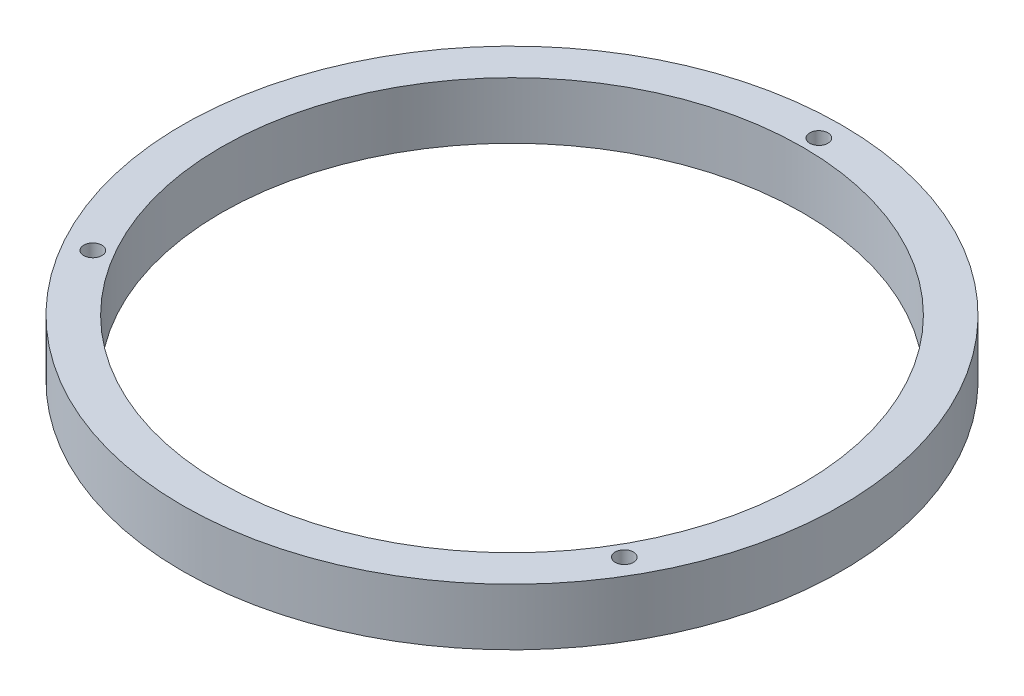
ISO-10303-21;
HEADER;
FILE_DESCRIPTION(('STEP AP214'),'2;1');
FILE_NAME('part.step','',(''),(''),'','','');
FILE_SCHEMA(('AUTOMOTIVE_DESIGN { 1 0 10303 214 1 1 1 1 }'));
ENDSEC;
DATA;
#1=APPLICATION_CONTEXT('core data for automotive mechanical design processes');
#2=APPLICATION_PROTOCOL_DEFINITION('international standard','automotive_design',2000,#1);
#3=PRODUCT_CONTEXT('',#1,'mechanical');
#4=PRODUCT('Part','Part','',(#3));
#5=PRODUCT_RELATED_PRODUCT_CATEGORY('part','',(#4));
#6=PRODUCT_DEFINITION_FORMATION('','',#4);
#7=PRODUCT_DEFINITION_CONTEXT('part definition',#1,'design');
#8=PRODUCT_DEFINITION('design','',#6,#7);
#9=PRODUCT_DEFINITION_SHAPE('','',#8);
#10=(LENGTH_UNIT() NAMED_UNIT(*) SI_UNIT(.MILLI.,.METRE.));
#11=(NAMED_UNIT(*) PLANE_ANGLE_UNIT() SI_UNIT($,.RADIAN.));
#12=(NAMED_UNIT(*) SI_UNIT($,.STERADIAN.) SOLID_ANGLE_UNIT());
#13=UNCERTAINTY_MEASURE_WITH_UNIT(LENGTH_MEASURE(1.E-05),#10,'distance_accuracy_value','');
#14=(GEOMETRIC_REPRESENTATION_CONTEXT(3) GLOBAL_UNCERTAINTY_ASSIGNED_CONTEXT((#13)) GLOBAL_UNIT_ASSIGNED_CONTEXT((#10,
#11,#12)) REPRESENTATION_CONTEXT('',''));
#15=CARTESIAN_POINT('',(0.,0.,0.));
#16=DIRECTION('',(0.,0.,1.));
#17=DIRECTION('',(1.,0.,0.));
#18=AXIS2_PLACEMENT_3D('',#15,#16,#17);
#19=CARTESIAN_POINT('',(0.,12.5,0.));
#20=DIRECTION('',(0.,-1.,0.));
#21=DIRECTION('',(0.,0.,-1.));
#22=AXIS2_PLACEMENT_3D('',#19,#20,#21);
#23=CYLINDRICAL_SURFACE('',#22,64.);
#24=CARTESIAN_POINT('',(0.,12.5,0.));
#25=DIRECTION('',(0.,1.,0.));
#26=DIRECTION('',(0.,0.,1.));
#27=AXIS2_PLACEMENT_3D('',#24,#25,#26);
#28=CIRCLE('',#27,64.);
#29=CARTESIAN_POINT('',(0.,12.5,64.));
#30=VERTEX_POINT('',#29);
#31=EDGE_CURVE('E54',#30,#30,#28,.T.);
#32=ORIENTED_EDGE('',*,*,#31,.T.);
#33=EDGE_LOOP('',(#32));
#34=FACE_BOUND('',#33,.T.);
#35=CARTESIAN_POINT('',(0.,0.,0.));
#36=DIRECTION('',(0.,1.,0.));
#37=DIRECTION('',(0.,0.,1.));
#38=AXIS2_PLACEMENT_3D('',#35,#36,#37);
#39=CIRCLE('',#38,64.);
#40=CARTESIAN_POINT('',(0.,0.,64.));
#41=VERTEX_POINT('',#40);
#42=EDGE_CURVE('E75',#41,#41,#39,.T.);
#43=ORIENTED_EDGE('',*,*,#42,.F.);
#44=EDGE_LOOP('',(#43));
#45=FACE_BOUND('',#44,.T.);
#46=ADVANCED_FACE('F45',(#34,#45),#23,.F.);
#47=CARTESIAN_POINT('',(0.,12.5,-67.5));
#48=DIRECTION('',(0.,-1.,0.));
#49=DIRECTION('',(0.,0.,-1.));
#50=AXIS2_PLACEMENT_3D('',#47,#48,#49);
#51=CYLINDRICAL_SURFACE('',#50,2.);
#52=CARTESIAN_POINT('',(0.,12.5,-67.5));
#53=DIRECTION('',(0.,1.,0.));
#54=DIRECTION('',(0.,0.,1.));
#55=AXIS2_PLACEMENT_3D('',#52,#53,#54);
#56=CIRCLE('',#55,2.);
#57=CARTESIAN_POINT('',(0.,12.5,-65.5));
#58=VERTEX_POINT('',#57);
#59=EDGE_CURVE('E60',#58,#58,#56,.T.);
#60=ORIENTED_EDGE('',*,*,#59,.T.);
#61=EDGE_LOOP('',(#60));
#62=FACE_BOUND('',#61,.T.);
#63=CARTESIAN_POINT('',(0.,0.,-67.5));
#64=DIRECTION('',(0.,1.,0.));
#65=DIRECTION('',(0.,0.,1.));
#66=AXIS2_PLACEMENT_3D('',#63,#64,#65);
#67=CIRCLE('',#66,2.);
#68=CARTESIAN_POINT('',(0.,0.,-65.5));
#69=VERTEX_POINT('',#68);
#70=EDGE_CURVE('E72',#69,#69,#67,.T.);
#71=ORIENTED_EDGE('',*,*,#70,.F.);
#72=EDGE_LOOP('',(#71));
#73=FACE_BOUND('',#72,.T.);
#74=ADVANCED_FACE('F98',(#62,#73),#51,.F.);
#75=CARTESIAN_POINT('',(58.4567147554536,12.5,33.7499999999977));
#76=DIRECTION('',(0.,-1.,0.));
#77=DIRECTION('',(0.,0.,-1.));
#78=AXIS2_PLACEMENT_3D('',#75,#76,#77);
#79=CYLINDRICAL_SURFACE('',#78,2.);
#80=CARTESIAN_POINT('',(58.4567147554536,12.5,33.7499999999977));
#81=DIRECTION('',(0.,1.,0.));
#82=DIRECTION('',(0.,0.,1.));
#83=AXIS2_PLACEMENT_3D('',#80,#81,#82);
#84=CIRCLE('',#83,2.);
#85=CARTESIAN_POINT('',(58.4567147554536,12.5,35.7499999999977));
#86=VERTEX_POINT('',#85);
#87=EDGE_CURVE('E87',#86,#86,#84,.T.);
#88=ORIENTED_EDGE('',*,*,#87,.T.);
#89=EDGE_LOOP('',(#88));
#90=FACE_BOUND('',#89,.T.);
#91=CARTESIAN_POINT('',(58.4567147554536,0.,33.7499999999977));
#92=DIRECTION('',(0.,1.,0.));
#93=DIRECTION('',(0.,0.,1.));
#94=AXIS2_PLACEMENT_3D('',#91,#92,#93);
#95=CIRCLE('',#94,2.);
#96=CARTESIAN_POINT('',(58.4567147554536,0.,35.7499999999977));
#97=VERTEX_POINT('',#96);
#98=EDGE_CURVE('E68',#97,#97,#95,.T.);
#99=ORIENTED_EDGE('',*,*,#98,.F.);
#100=EDGE_LOOP('',(#99));
#101=FACE_BOUND('',#100,.T.);
#102=ADVANCED_FACE('F116',(#90,#101),#79,.F.);
#103=CARTESIAN_POINT('',(-58.4567147554457,12.5,33.7500000000023));
#104=DIRECTION('',(0.,-1.,0.));
#105=DIRECTION('',(0.,0.,-1.));
#106=AXIS2_PLACEMENT_3D('',#103,#104,#105);
#107=CYLINDRICAL_SURFACE('',#106,2.);
#108=CARTESIAN_POINT('',(-58.4567147554457,12.5,33.7500000000023));
#109=DIRECTION('',(0.,1.,0.));
#110=DIRECTION('',(0.,0.,1.));
#111=AXIS2_PLACEMENT_3D('',#108,#109,#110);
#112=CIRCLE('',#111,2.);
#113=CARTESIAN_POINT('',(-58.4567147554457,12.5,35.7500000000023));
#114=VERTEX_POINT('',#113);
#115=EDGE_CURVE('E82',#114,#114,#112,.T.);
#116=ORIENTED_EDGE('',*,*,#115,.T.);
#117=EDGE_LOOP('',(#116));
#118=FACE_BOUND('',#117,.T.);
#119=CARTESIAN_POINT('',(-58.4567147554457,0.,33.7500000000023));
#120=DIRECTION('',(0.,1.,0.));
#121=DIRECTION('',(0.,0.,1.));
#122=AXIS2_PLACEMENT_3D('',#119,#120,#121);
#123=CIRCLE('',#122,2.);
#124=CARTESIAN_POINT('',(-58.4567147554457,0.,35.7500000000023));
#125=VERTEX_POINT('',#124);
#126=EDGE_CURVE('E64',#125,#125,#123,.T.);
#127=ORIENTED_EDGE('',*,*,#126,.F.);
#128=EDGE_LOOP('',(#127));
#129=FACE_BOUND('',#128,.T.);
#130=ADVANCED_FACE('F47',(#118,#129),#107,.F.);
#131=CARTESIAN_POINT('',(0.,12.5,0.));
#132=DIRECTION('',(0.,-1.,0.));
#133=DIRECTION('',(0.,0.,-1.));
#134=AXIS2_PLACEMENT_3D('',#131,#132,#133);
#135=CYLINDRICAL_SURFACE('',#134,72.5);
#136=CARTESIAN_POINT('',(0.,12.5,0.));
#137=DIRECTION('',(0.,1.,0.));
#138=DIRECTION('',(0.,0.,1.));
#139=AXIS2_PLACEMENT_3D('',#136,#137,#138);
#140=CIRCLE('',#139,72.5);
#141=CARTESIAN_POINT('',(0.,12.5,72.5));
#142=VERTEX_POINT('',#141);
#143=EDGE_CURVE('E10',#142,#142,#140,.T.);
#144=ORIENTED_EDGE('',*,*,#143,.F.);
#145=EDGE_LOOP('',(#144));
#146=FACE_BOUND('',#145,.T.);
#147=CARTESIAN_POINT('',(0.,0.,0.));
#148=DIRECTION('',(0.,1.,0.));
#149=DIRECTION('',(0.,0.,1.));
#150=AXIS2_PLACEMENT_3D('',#147,#148,#149);
#151=CIRCLE('',#150,72.5);
#152=CARTESIAN_POINT('',(0.,0.,72.5));
#153=VERTEX_POINT('',#152);
#154=EDGE_CURVE('E49',#153,#153,#151,.T.);
#155=ORIENTED_EDGE('',*,*,#154,.T.);
#156=EDGE_LOOP('',(#155));
#157=FACE_BOUND('',#156,.T.);
#158=ADVANCED_FACE('F105',(#146,#157),#135,.T.);
#159=CARTESIAN_POINT('',(0.,12.5,0.));
#160=DIRECTION('',(0.,1.,0.));
#161=DIRECTION('',(0.,0.,1.));
#162=AXIS2_PLACEMENT_3D('',#159,#160,#161);
#163=PLANE('',#162);
#164=ORIENTED_EDGE('',*,*,#115,.F.);
#165=EDGE_LOOP('',(#164));
#166=FACE_BOUND('',#165,.T.);
#167=ORIENTED_EDGE('',*,*,#87,.F.);
#168=EDGE_LOOP('',(#167));
#169=FACE_BOUND('',#168,.T.);
#170=ORIENTED_EDGE('',*,*,#59,.F.);
#171=EDGE_LOOP('',(#170));
#172=FACE_BOUND('',#171,.T.);
#173=ORIENTED_EDGE('',*,*,#31,.F.);
#174=EDGE_LOOP('',(#173));
#175=FACE_BOUND('',#174,.T.);
#176=ORIENTED_EDGE('',*,*,#143,.T.);
#177=EDGE_LOOP('',(#176));
#178=FACE_BOUND('',#177,.T.);
#179=ADVANCED_FACE('F101',(#166,#169,#172,#175,#178),#163,.T.);
#180=CARTESIAN_POINT('',(0.,0.,0.));
#181=DIRECTION('',(0.,1.,0.));
#182=DIRECTION('',(0.,0.,1.));
#183=AXIS2_PLACEMENT_3D('',#180,#181,#182);
#184=PLANE('',#183);
#185=ORIENTED_EDGE('',*,*,#126,.T.);
#186=EDGE_LOOP('',(#185));
#187=FACE_BOUND('',#186,.T.);
#188=ORIENTED_EDGE('',*,*,#98,.T.);
#189=EDGE_LOOP('',(#188));
#190=FACE_BOUND('',#189,.T.);
#191=ORIENTED_EDGE('',*,*,#70,.T.);
#192=EDGE_LOOP('',(#191));
#193=FACE_BOUND('',#192,.T.);
#194=ORIENTED_EDGE('',*,*,#42,.T.);
#195=EDGE_LOOP('',(#194));
#196=FACE_BOUND('',#195,.T.);
#197=ORIENTED_EDGE('',*,*,#154,.F.);
#198=EDGE_LOOP('',(#197));
#199=FACE_BOUND('',#198,.T.);
#200=ADVANCED_FACE('F104',(#187,#190,#193,#196,#199),#184,.F.);
#201=CLOSED_SHELL('',(#46,#74,#102,#130,#158,#179,#200));
#202=MANIFOLD_SOLID_BREP('B2',#201);
#203=ADVANCED_BREP_SHAPE_REPRESENTATION('',(#18,#202),#14);
#204=SHAPE_DEFINITION_REPRESENTATION(#9,#203);
ENDSEC;
END-ISO-10303-21;
